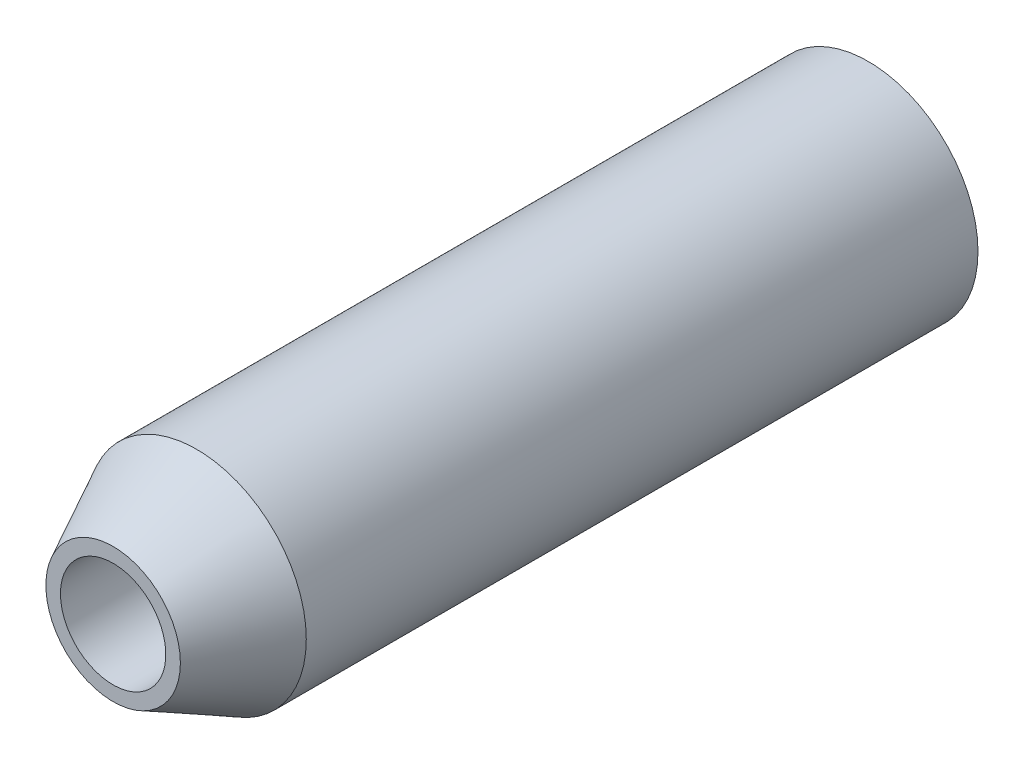
ISO-10303-21;
HEADER;
FILE_DESCRIPTION(('STEP AP214'),'2;1');
FILE_NAME('part.step','',(''),(''),'','','');
FILE_SCHEMA(('AUTOMOTIVE_DESIGN { 1 0 10303 214 1 1 1 1 }'));
ENDSEC;
DATA;
#1=APPLICATION_CONTEXT('core data for automotive mechanical design processes');
#2=APPLICATION_PROTOCOL_DEFINITION('international standard','automotive_design',2000,#1);
#3=PRODUCT_CONTEXT('',#1,'mechanical');
#4=PRODUCT('Part','Part','',(#3));
#5=PRODUCT_RELATED_PRODUCT_CATEGORY('part','',(#4));
#6=PRODUCT_DEFINITION_FORMATION('','',#4);
#7=PRODUCT_DEFINITION_CONTEXT('part definition',#1,'design');
#8=PRODUCT_DEFINITION('design','',#6,#7);
#9=PRODUCT_DEFINITION_SHAPE('','',#8);
#10=(LENGTH_UNIT() NAMED_UNIT(*) SI_UNIT(.MILLI.,.METRE.));
#11=(NAMED_UNIT(*) PLANE_ANGLE_UNIT() SI_UNIT($,.RADIAN.));
#12=(NAMED_UNIT(*) SI_UNIT($,.STERADIAN.) SOLID_ANGLE_UNIT());
#13=UNCERTAINTY_MEASURE_WITH_UNIT(LENGTH_MEASURE(1.E-05),#10,'distance_accuracy_value','');
#14=(GEOMETRIC_REPRESENTATION_CONTEXT(3) GLOBAL_UNCERTAINTY_ASSIGNED_CONTEXT((#13)) GLOBAL_UNIT_ASSIGNED_CONTEXT((#10,
#11,#12)) REPRESENTATION_CONTEXT('',''));
#15=CARTESIAN_POINT('',(0.,0.,0.));
#16=DIRECTION('',(0.,0.,1.));
#17=DIRECTION('',(1.,0.,0.));
#18=AXIS2_PLACEMENT_3D('',#15,#16,#17);
#19=CARTESIAN_POINT('',(0.,0.,10.922));
#20=DIRECTION('',(0.,0.,-1.));
#21=DIRECTION('',(-1.,0.,0.));
#22=AXIS2_PLACEMENT_3D('',#19,#20,#21);
#23=CYLINDRICAL_SURFACE('',#22,3.175);
#24=CARTESIAN_POINT('',(0.,0.,8.50899999999998));
#25=DIRECTION('',(0.,0.,1.));
#26=DIRECTION('',(1.,0.,0.));
#27=AXIS2_PLACEMENT_3D('',#24,#25,#26);
#28=CIRCLE('',#27,3.175);
#29=CARTESIAN_POINT('',(3.175,0.,8.50899999999998));
#30=VERTEX_POINT('',#29);
#31=EDGE_CURVE('E10',#30,#30,#28,.F.);
#32=ORIENTED_EDGE('',*,*,#31,.T.);
#33=EDGE_LOOP('',(#32));
#34=FACE_BOUND('',#33,.T.);
#35=CARTESIAN_POINT('',(0.,0.,-10.922));
#36=DIRECTION('',(0.,0.,1.));
#37=DIRECTION('',(1.,0.,0.));
#38=AXIS2_PLACEMENT_3D('',#35,#36,#37);
#39=CIRCLE('',#38,3.175);
#40=CARTESIAN_POINT('',(3.175,0.,-10.922));
#41=VERTEX_POINT('',#40);
#42=EDGE_CURVE('E53',#41,#41,#39,.T.);
#43=ORIENTED_EDGE('',*,*,#42,.T.);
#44=EDGE_LOOP('',(#43));
#45=FACE_BOUND('',#44,.T.);
#46=ADVANCED_FACE('F38',(#34,#45),#23,.T.);
#47=CARTESIAN_POINT('',(0.,0.,10.922));
#48=DIRECTION('',(0.,0.,1.));
#49=DIRECTION('',(1.,0.,0.));
#50=AXIS2_PLACEMENT_3D('',#47,#48,#49);
#51=PLANE('',#50);
#52=CARTESIAN_POINT('',(0.,0.,10.922));
#53=DIRECTION('',(0.,0.,1.));
#54=DIRECTION('',(1.,0.,0.));
#55=AXIS2_PLACEMENT_3D('',#52,#53,#54);
#56=CIRCLE('',#55,1.94551509036994);
#57=CARTESIAN_POINT('',(1.94551509036994,0.,10.922));
#58=VERTEX_POINT('',#57);
#59=EDGE_CURVE('E47',#58,#58,#56,.T.);
#60=ORIENTED_EDGE('',*,*,#59,.T.);
#61=EDGE_LOOP('',(#60));
#62=FACE_BOUND('',#61,.T.);
#63=CARTESIAN_POINT('',(0.,0.,10.922));
#64=DIRECTION('',(0.,0.,-1.));
#65=DIRECTION('',(-1.,0.,0.));
#66=AXIS2_PLACEMENT_3D('',#63,#64,#65);
#67=CIRCLE('',#66,1.52399999999999);
#68=CARTESIAN_POINT('',(-1.52399999999999,0.,10.922));
#69=VERTEX_POINT('',#68);
#70=EDGE_CURVE('E59',#69,#69,#67,.T.);
#71=ORIENTED_EDGE('',*,*,#70,.T.);
#72=EDGE_LOOP('',(#71));
#73=FACE_BOUND('',#72,.T.);
#74=ADVANCED_FACE('F85',(#62,#73),#51,.T.);
#75=CARTESIAN_POINT('',(0.,0.,-10.922));
#76=DIRECTION('',(0.,0.,1.));
#77=DIRECTION('',(1.,0.,0.));
#78=AXIS2_PLACEMENT_3D('',#75,#76,#77);
#79=PLANE('',#78);
#80=CARTESIAN_POINT('',(0.,0.,-10.922));
#81=DIRECTION('',(0.,0.,-1.));
#82=DIRECTION('',(-1.,0.,0.));
#83=AXIS2_PLACEMENT_3D('',#80,#81,#82);
#84=CIRCLE('',#83,2.34949999999999);
#85=CARTESIAN_POINT('',(-2.34949999999999,0.,-10.922));
#86=VERTEX_POINT('',#85);
#87=EDGE_CURVE('E73',#86,#86,#84,.T.);
#88=ORIENTED_EDGE('',*,*,#87,.F.);
#89=EDGE_LOOP('',(#88));
#90=FACE_BOUND('',#89,.T.);
#91=ORIENTED_EDGE('',*,*,#42,.F.);
#92=EDGE_LOOP('',(#91));
#93=FACE_BOUND('',#92,.T.);
#94=ADVANCED_FACE('F81',(#90,#93),#79,.F.);
#95=CARTESIAN_POINT('',(0.,0.,-10.922));
#96=DIRECTION('',(0.,0.,-1.));
#97=DIRECTION('',(-1.,0.,0.));
#98=AXIS2_PLACEMENT_3D('',#95,#96,#97);
#99=CYLINDRICAL_SURFACE('',#98,1.524);
#100=ORIENTED_EDGE('',*,*,#70,.F.);
#101=EDGE_LOOP('',(#100));
#102=FACE_BOUND('',#101,.T.);
#103=CARTESIAN_POINT('',(0.,0.,6.223));
#104=DIRECTION('',(0.,0.,-1.));
#105=DIRECTION('',(-1.,0.,0.));
#106=AXIS2_PLACEMENT_3D('',#103,#104,#105);
#107=CIRCLE('',#106,1.524);
#108=CARTESIAN_POINT('',(-1.524,0.,6.223));
#109=VERTEX_POINT('',#108);
#110=EDGE_CURVE('E65',#109,#109,#107,.T.);
#111=ORIENTED_EDGE('',*,*,#110,.T.);
#112=EDGE_LOOP('',(#111));
#113=FACE_BOUND('',#112,.T.);
#114=ADVANCED_FACE('F84',(#102,#113),#99,.F.);
#115=CARTESIAN_POINT('',(1.524,0.,6.223));
#116=DIRECTION('',(0.,0.,1.));
#117=DIRECTION('',(1.,0.,0.));
#118=AXIS2_PLACEMENT_3D('',#115,#116,#117);
#119=PLANE('',#118);
#120=ORIENTED_EDGE('',*,*,#110,.F.);
#121=EDGE_LOOP('',(#120));
#122=FACE_BOUND('',#121,.T.);
#123=CARTESIAN_POINT('',(0.,0.,6.223));
#124=DIRECTION('',(0.,0.,-1.));
#125=DIRECTION('',(-1.,0.,0.));
#126=AXIS2_PLACEMENT_3D('',#123,#124,#125);
#127=CIRCLE('',#126,2.3495);
#128=CARTESIAN_POINT('',(-2.3495,0.,6.223));
#129=VERTEX_POINT('',#128);
#130=EDGE_CURVE('E69',#129,#129,#127,.T.);
#131=ORIENTED_EDGE('',*,*,#130,.T.);
#132=EDGE_LOOP('',(#131));
#133=FACE_BOUND('',#132,.T.);
#134=ADVANCED_FACE('F97',(#122,#133),#119,.F.);
#135=CARTESIAN_POINT('',(0.,0.,-10.922));
#136=DIRECTION('',(0.,0.,-1.));
#137=DIRECTION('',(-1.,0.,0.));
#138=AXIS2_PLACEMENT_3D('',#135,#136,#137);
#139=CYLINDRICAL_SURFACE('',#138,2.3495);
#140=ORIENTED_EDGE('',*,*,#130,.F.);
#141=EDGE_LOOP('',(#140));
#142=FACE_BOUND('',#141,.T.);
#143=ORIENTED_EDGE('',*,*,#87,.T.);
#144=EDGE_LOOP('',(#143));
#145=FACE_BOUND('',#144,.T.);
#146=ADVANCED_FACE('F79',(#142,#145),#139,.F.);
#147=CARTESIAN_POINT('',(0.,0.,10.922));
#148=DIRECTION('',(0.,0.,-1.));
#149=DIRECTION('',(-1.,0.,0.));
#150=AXIS2_PLACEMENT_3D('',#147,#148,#149);
#151=CONICAL_SURFACE('',#150,1.94551509036994,0.471238898038466);
#152=ORIENTED_EDGE('',*,*,#31,.F.);
#153=EDGE_LOOP('',(#152));
#154=FACE_BOUND('',#153,.T.);
#155=ORIENTED_EDGE('',*,*,#59,.F.);
#156=EDGE_LOOP('',(#155));
#157=FACE_BOUND('',#156,.T.);
#158=ADVANCED_FACE('F41',(#154,#157),#151,.T.);
#159=CLOSED_SHELL('',(#46,#74,#94,#114,#134,#146,#158));
#160=MANIFOLD_SOLID_BREP('B2',#159);
#161=ADVANCED_BREP_SHAPE_REPRESENTATION('',(#18,#160),#14);
#162=SHAPE_DEFINITION_REPRESENTATION(#9,#161);
ENDSEC;
END-ISO-10303-21;
